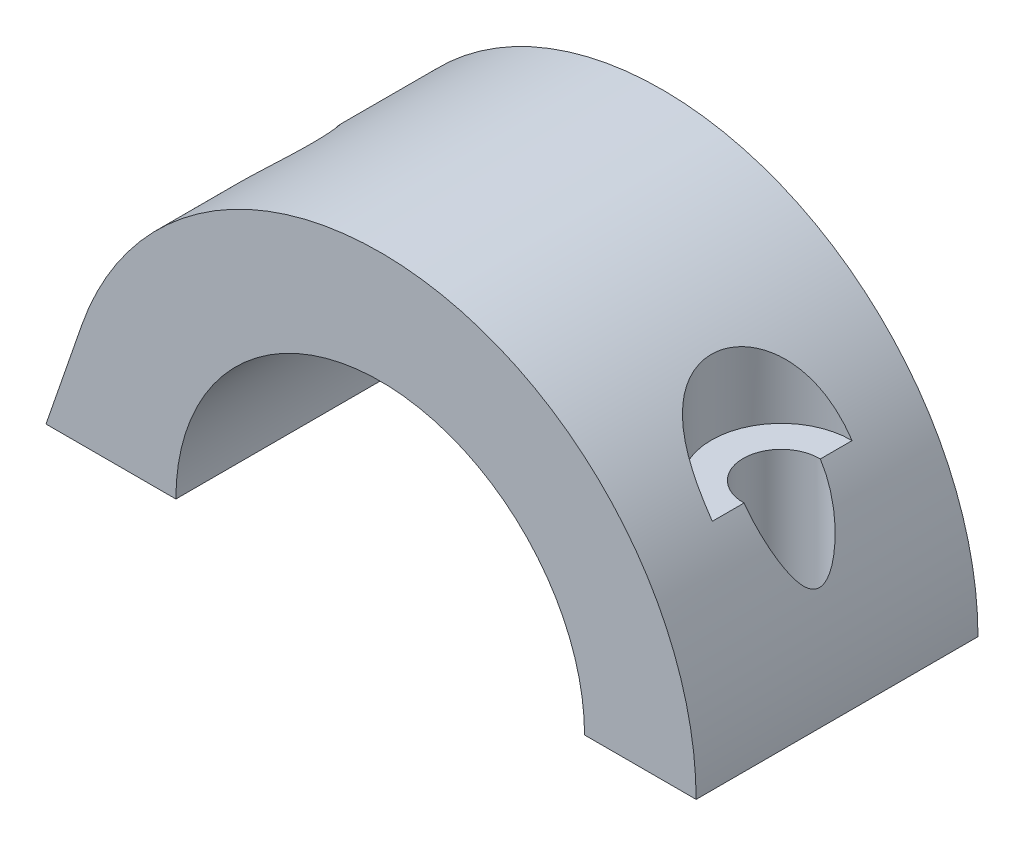
ISO-10303-21;
HEADER;
FILE_DESCRIPTION(('STEP AP214'),'2;1');
FILE_NAME('part.step','',(''),(''),'','','');
FILE_SCHEMA(('AUTOMOTIVE_DESIGN { 1 0 10303 214 1 1 1 1 }'));
ENDSEC;
DATA;
#1=APPLICATION_CONTEXT('core data for automotive mechanical design processes');
#2=APPLICATION_PROTOCOL_DEFINITION('international standard','automotive_design',2000,#1);
#3=PRODUCT_CONTEXT('',#1,'mechanical');
#4=PRODUCT('Part','Part','',(#3));
#5=PRODUCT_RELATED_PRODUCT_CATEGORY('part','',(#4));
#6=PRODUCT_DEFINITION_FORMATION('','',#4);
#7=PRODUCT_DEFINITION_CONTEXT('part definition',#1,'design');
#8=PRODUCT_DEFINITION('design','',#6,#7);
#9=PRODUCT_DEFINITION_SHAPE('','',#8);
#10=(LENGTH_UNIT() NAMED_UNIT(*) SI_UNIT(.MILLI.,.METRE.));
#11=(NAMED_UNIT(*) PLANE_ANGLE_UNIT() SI_UNIT($,.RADIAN.));
#12=(NAMED_UNIT(*) SI_UNIT($,.STERADIAN.) SOLID_ANGLE_UNIT());
#13=UNCERTAINTY_MEASURE_WITH_UNIT(LENGTH_MEASURE(1.E-05),#10,'distance_accuracy_value','');
#14=(GEOMETRIC_REPRESENTATION_CONTEXT(3) GLOBAL_UNCERTAINTY_ASSIGNED_CONTEXT((#13)) GLOBAL_UNIT_ASSIGNED_CONTEXT((#10,
#11,#12)) REPRESENTATION_CONTEXT('',''));
#15=CARTESIAN_POINT('',(0.,0.,0.));
#16=DIRECTION('',(0.,0.,1.));
#17=DIRECTION('',(1.,0.,0.));
#18=AXIS2_PLACEMENT_3D('',#15,#16,#17);
#19=CARTESIAN_POINT('',(0.,0.,11.09));
#20=DIRECTION('',(0.,0.,-1.));
#21=DIRECTION('',(-1.,0.,0.));
#22=AXIS2_PLACEMENT_3D('',#19,#20,#21);
#23=CYLINDRICAL_SURFACE('',#22,12.43);
#24=DIRECTION('',(0.,0.,-1.));
#25=VECTOR('',#24,1.);
#26=CARTESIAN_POINT('',(10.2715578175854,7.,11.09));
#27=LINE('',#26,#25);
#28=CARTESIAN_POINT('',(10.2715578175854,7.,8.29475699398572));
#29=VERTEX_POINT('',#28);
#30=CARTESIAN_POINT('',(10.2715578175854,7.,7.04455444248396));
#31=VERTEX_POINT('',#30);
#32=EDGE_CURVE('E75',#29,#31,#27,.T.);
#33=ORIENTED_EDGE('',*,*,#32,.F.);
#34=CARTESIAN_POINT('',(10.2715578175854,7.,8.29475699398572));
#35=CARTESIAN_POINT('',(10.1775743528023,7.13796097149501,8.29596635901824));
#36=CARTESIAN_POINT('',(10.0806647733626,7.27413950385768,8.29246732032034));
#37=CARTESIAN_POINT('',(9.88143176219571,7.5425504361619,8.27403109068999));
#38=CARTESIAN_POINT('',(9.77908706791482,7.674763600745,8.25904534059461));
#39=CARTESIAN_POINT('',(9.56875440357493,7.93550983106315,8.21526166376967));
#40=CARTESIAN_POINT('',(9.46070697301482,8.06396408100375,8.18627080788423));
#41=CARTESIAN_POINT('',(9.24214240736493,8.31355176391438,8.112105016515));
#42=CARTESIAN_POINT('',(9.13163050609764,8.43469900065435,8.06696178995224));
#43=CARTESIAN_POINT('',(8.90248492159863,8.67642027864925,7.95421876278325));
#44=CARTESIAN_POINT('',(8.78382699503538,8.7963539793624,7.88526215604817));
#45=CARTESIAN_POINT('',(8.5509597080208,9.02287078043261,7.72363577255358));
#46=CARTESIAN_POINT('',(8.43673163596638,9.12951554111868,7.63108208879948));
#47=CARTESIAN_POINT('',(8.23470266467567,9.31183343570367,7.43653311036682));
#48=CARTESIAN_POINT('',(8.14552007951442,9.38975099451332,7.33809363161442));
#49=CARTESIAN_POINT('',(7.97859132902156,9.53199922416819,7.1228487105849));
#50=CARTESIAN_POINT('',(7.90085204360757,9.59632173146949,7.00603230636266));
#51=CARTESIAN_POINT('',(7.79638657853738,9.68108010804122,6.818141544617));
#52=CARTESIAN_POINT('',(7.76346844111074,9.70747049770775,6.75307867186874));
#53=CARTESIAN_POINT('',(7.70242742570889,9.75597382864995,6.61923196333829));
#54=CARTESIAN_POINT('',(7.67430203867741,9.77808900886395,6.55045009948663));
#55=CARTESIAN_POINT('',(7.6234147460337,9.81781518485233,6.40970667034809));
#56=CARTESIAN_POINT('',(7.60065028834737,9.83542832416881,6.33774663748509));
#57=CARTESIAN_POINT('',(7.56094730217063,9.86598173978964,6.19130299871263));
#58=CARTESIAN_POINT('',(7.54400776829297,9.87892282251455,6.11681983073903));
#59=CARTESIAN_POINT('',(7.50644227470543,9.90753101585373,5.91202703709468));
#60=CARTESIAN_POINT('',(7.49183576527122,9.91853501841631,5.7798676318976));
#61=CARTESIAN_POINT('',(7.48196345584333,9.925984045734,5.51452655154878));
#62=CARTESIAN_POINT('',(7.4866886489032,9.92243585058667,5.38134538131685));
#63=CARTESIAN_POINT('',(7.51414814479702,9.90165302973389,5.12699316643034));
#64=CARTESIAN_POINT('',(7.53566507085221,9.88534338803625,5.00561206509047));
#65=CARTESIAN_POINT('',(7.59396135844462,9.84062944404057,4.76893739410604));
#66=CARTESIAN_POINT('',(7.63074014091614,9.81222560061994,4.65364359368405));
#67=CARTESIAN_POINT('',(7.71877198767471,9.7431337317858,4.42871722956267));
#68=CARTESIAN_POINT('',(7.77039713084521,9.70212777858714,4.31932932750632));
#69=CARTESIAN_POINT('',(7.88502292588359,9.60920109463564,4.11175736331971));
#70=CARTESIAN_POINT('',(7.94802818204487,9.5572759446703,4.01357786234651));
#71=CARTESIAN_POINT('',(8.08997270692946,9.43751847343814,3.81950039283026));
#72=CARTESIAN_POINT('',(8.16990064365103,9.36856830126274,3.72502220087933));
#73=CARTESIAN_POINT('',(8.33670907336169,9.22044554245154,3.5516410098516));
#74=CARTESIAN_POINT('',(8.42358998005341,9.14127234737234,3.47273893852577));
#75=CARTESIAN_POINT('',(8.58059709421522,8.99372174239174,3.34656602738719));
#76=CARTESIAN_POINT('',(8.64993374561702,8.92710153399751,3.29620364482466));
#77=CARTESIAN_POINT('',(8.78979999915871,8.78942428062605,3.20386319400854));
#78=CARTESIAN_POINT('',(8.86033013009868,8.71836522927841,3.16188895374464));
#79=CARTESIAN_POINT('',(9.07291046050292,8.49874073109993,3.04739241405974));
#80=CARTESIAN_POINT('',(9.21537731312661,8.34426096398068,2.9867357103872));
#81=CARTESIAN_POINT('',(9.43679154240441,8.09118595196006,2.9119904362259));
#82=CARTESIAN_POINT('',(9.51732274907083,7.99632100390374,2.88904024069819));
#83=CARTESIAN_POINT('',(9.67629528119657,7.8031924971021,2.85111405471563));
#84=CARTESIAN_POINT('',(9.75473561611577,7.70492737647739,2.83614178214999));
#85=CARTESIAN_POINT('',(9.90797287121626,7.50682785632691,2.81342798205444));
#86=CARTESIAN_POINT('',(9.9828033554425,7.40702909905654,2.80559726961814));
#87=CARTESIAN_POINT('',(10.1294709872541,7.20515830323086,2.79604847419687));
#88=CARTESIAN_POINT('',(10.2013118583966,7.10308935124771,2.79432254793103));
#89=CARTESIAN_POINT('',(10.2715578175854,7.,2.79524300601428));
#90=B_SPLINE_CURVE_WITH_KNOTS('',3,(#34,#35,#36,#37,#38,#39,#40,#41,#42,#43,#44,#45,#46,#47,#48,
#49,#50,#51,#52,#53,#54,#55,#56,#57,#58,#59,#60,#61,#62,#63,#64,#65,#66,#67,#68,#69,#70,#71,#72,
#73,#74,#75,#76,#77,#78,#79,#80,#81,#82,#83,#84,#85,#86,#87,#88,#89),.UNSPECIFIED.,.F.,.F.,(4,2,
2,2,2,2,2,2,2,2,2,2,2,2,2,2,2,2,2,2,2,2,2,2,2,2,2,4),(0.,0.500917454493598,1.003964256788,
1.51414748353912,2.02333460931288,2.56835587102882,3.11074580428216,3.57094779692195,
4.03142535101869,4.26376339855895,4.49597943845786,4.72808470726739,4.96014989435971,
5.35808892765878,5.75584257597763,6.12716961638009,6.49848256917162,6.88006182361467,
7.26179580889491,7.68521318300876,8.10865576926938,8.43385305472835,8.75919840912167,
9.41254918330484,9.79192155799501,10.1714705743514,10.5462120979543,10.920471987526),.UNSPECIFIED.);
#91=CARTESIAN_POINT('',(10.2715578175854,7.,2.79524300601428));
#92=VERTEX_POINT('',#91);
#93=EDGE_CURVE('E60',#29,#92,#90,.T.);
#94=ORIENTED_EDGE('',*,*,#93,.T.);
#95=CARTESIAN_POINT('',(10.2715578175854,7.,4.04544555751604));
#96=VERTEX_POINT('',#95);
#97=EDGE_CURVE('E138',#96,#92,#27,.T.);
#98=ORIENTED_EDGE('',*,*,#97,.F.);
#99=CARTESIAN_POINT('',(11.735,4.09813067141594,5.545));
#100=CARTESIAN_POINT('',(11.734998201274,4.09813626053815,5.57751495527273));
#101=CARTESIAN_POINT('',(11.7339280176693,4.10120417459427,5.61005343260603));
#102=CARTESIAN_POINT('',(11.7297920342744,4.11301771860877,5.6739575953403));
#103=CARTESIAN_POINT('',(11.7267222097173,4.12177479931369,5.70532078024865));
#104=CARTESIAN_POINT('',(11.7178411400628,4.14696499837935,5.77461120409417));
#105=CARTESIAN_POINT('',(11.7115039695034,4.16485814549675,5.81192818159886));
#106=CARTESIAN_POINT('',(11.6968460766948,4.2058495996388,5.88313300196056));
#107=CARTESIAN_POINT('',(11.6885204104951,4.22896087241186,5.91701199302612));
#108=CARTESIAN_POINT('',(11.6627523874635,4.29970410786186,6.00911009138384));
#109=CARTESIAN_POINT('',(11.6435694818032,4.35150027914869,6.06358470417758));
#110=CARTESIAN_POINT('',(11.6020699572367,4.46098219857436,6.1647586640645));
#111=CARTESIAN_POINT('',(11.5797438822152,4.51868556986004,6.21143358353822));
#112=CARTESIAN_POINT('',(11.5286781128142,4.64758679376911,6.3064322822024));
#113=CARTESIAN_POINT('',(11.4994948822293,4.7194030853849,6.35366904339458));
#114=CARTESIAN_POINT('',(11.4383992002789,4.8656172651737,6.44205625042915));
#115=CARTESIAN_POINT('',(11.4064836033112,4.94001806857768,6.48319952840527));
#116=CARTESIAN_POINT('',(11.3401295703003,5.09049483767551,6.56052318963946));
#117=CARTESIAN_POINT('',(11.3056854858686,5.16657427090231,6.59669190872918));
#118=CARTESIAN_POINT('',(11.2344785350862,5.3196360033735,6.66457982270113));
#119=CARTESIAN_POINT('',(11.1977150575907,5.39661853619218,6.69629783769401));
#120=CARTESIAN_POINT('',(11.0968312613977,5.60229226874741,6.77531083086894));
#121=CARTESIAN_POINT('',(11.0307359540995,5.73142126468089,6.8189879699385));
#122=CARTESIAN_POINT('',(10.8925910524162,5.98981301367073,6.89548161425763));
#123=CARTESIAN_POINT('',(10.8205371764464,6.11907579583243,6.92829022358208));
#124=CARTESIAN_POINT('',(10.6709058278837,6.37642250340568,6.98246397029529));
#125=CARTESIAN_POINT('',(10.5933413718855,6.50450844949929,7.00385512131246));
#126=CARTESIAN_POINT('',(10.432967048877,6.75874734297934,7.03411383260275));
#127=CARTESIAN_POINT('',(10.3501617202361,6.884901848439,7.04299207757499));
#128=CARTESIAN_POINT('',(10.169437051934,7.14955583888074,7.04661645646634));
#129=CARTESIAN_POINT('',(10.0709076939268,7.28767861080873,7.03950181348377));
#130=CARTESIAN_POINT('',(9.86966527347856,7.55796553406584,7.00341319214272));
#131=CARTESIAN_POINT('',(9.76695770753578,7.69013706075935,6.97446710637854));
#132=CARTESIAN_POINT('',(9.58741319003649,7.91209579239219,6.90052959396313));
#133=CARTESIAN_POINT('',(9.51074345817492,8.00401532553259,6.8616105817075));
#134=CARTESIAN_POINT('',(9.35951700963344,8.18032495213465,6.76626913904293));
#135=CARTESIAN_POINT('',(9.2849570642258,8.26472702864459,6.70987523113521));
#136=CARTESIAN_POINT('',(9.16359775551111,8.3987480154149,6.59701949959309));
#137=CARTESIAN_POINT('',(9.1151889878102,8.4511978611851,6.54567020731706));
#138=CARTESIAN_POINT('',(9.02356882778923,8.54895110812049,6.4325326211845));
#139=CARTESIAN_POINT('',(8.98035025133086,8.59426441523172,6.37075904820715));
#140=CARTESIAN_POINT('',(8.90960732235442,8.66751806521574,6.25012885978215));
#141=CARTESIAN_POINT('',(8.88067008758393,8.69712169767712,6.19311997675601));
#142=CARTESIAN_POINT('',(8.82950395664532,8.74906227822664,6.07304357567219));
#143=CARTESIAN_POINT('',(8.80727200040013,8.77140254145093,6.00997883869179));
#144=CARTESIAN_POINT('',(8.77097669192519,8.80769792239595,5.87862905152207));
#145=CARTESIAN_POINT('',(8.75697720909308,8.82158750582508,5.81030771738582));
#146=CARTESIAN_POINT('',(8.73866988704645,8.83972424253523,5.67113170303384));
#147=CARTESIAN_POINT('',(8.73435507695777,8.84397833131293,5.60027888228537));
#148=CARTESIAN_POINT('',(8.73571209586111,8.84263682269342,5.46779933233416));
#149=CARTESIAN_POINT('',(8.74018672497712,8.83822203216408,5.406142187504));
#150=CARTESIAN_POINT('',(8.75647250869395,8.82208701615342,5.28480306994476));
#151=CARTESIAN_POINT('',(8.76828321913303,8.81036723295145,5.22512097786686));
#152=CARTESIAN_POINT('',(8.79835175148018,8.78033871968954,5.10958332729706));
#153=CARTESIAN_POINT('',(8.81657039632381,8.76207001591138,5.05370692549464));
#154=CARTESIAN_POINT('',(8.85842119905158,8.71975689393834,4.94637196579531));
#155=CARTESIAN_POINT('',(8.88205564339352,8.69571003609676,4.89491528648017));
#156=CARTESIAN_POINT('',(8.94459705444434,8.63144452843406,4.77618983924408));
#157=CARTESIAN_POINT('',(8.98573165084154,8.58869121440812,4.71146166571192));
#158=CARTESIAN_POINT('',(9.07391636724061,8.49547436556447,4.59242427733491));
#159=CARTESIAN_POINT('',(9.12097878401415,8.44499475494607,4.5381373312284));
#160=CARTESIAN_POINT('',(9.23899196463987,8.31602951225907,4.41911628926505));
#161=CARTESIAN_POINT('',(9.31175655988209,8.23461020492472,4.3593836610214));
#162=CARTESIAN_POINT('',(9.46006008432302,8.06380996674828,4.25752649905553));
#163=CARTESIAN_POINT('',(9.53560310771654,7.97441698536703,4.21542918361999));
#164=CARTESIAN_POINT('',(9.66915784119895,7.81157375030617,4.15435969666794));
#165=CARTESIAN_POINT('',(9.72716729877287,7.73924135662559,4.1322876245478));
#166=CARTESIAN_POINT('',(9.84248327518014,7.59204614350651,4.09600468357856));
#167=CARTESIAN_POINT('',(9.89978940682039,7.51718200858792,4.08179797025));
#168=CARTESIAN_POINT('',(10.0132525402738,7.36537020808085,4.06035574052764));
#169=CARTESIAN_POINT('',(10.0694066711844,7.28841823944853,4.05313595748605));
#170=CARTESIAN_POINT('',(10.1800853978122,7.13301272118419,4.04497897585848));
#171=CARTESIAN_POINT('',(10.2346094922717,7.05455872158022,4.04404369045102));
#172=CARTESIAN_POINT('',(10.3685904402913,6.85694811564139,4.04879390507863));
#173=CARTESIAN_POINT('',(10.4468694290406,6.73707057409173,4.05802699248198));
#174=CARTESIAN_POINT('',(10.5986683413674,6.49565174543085,4.08769783710957));
#175=CARTESIAN_POINT('',(10.6721851686465,6.37410943689708,4.1081428039978));
#176=CARTESIAN_POINT('',(10.8139920386018,6.13044129817094,4.15920172595626));
#177=CARTESIAN_POINT('',(10.8822914720962,6.00831695782045,4.1897968544988));
#178=CARTESIAN_POINT('',(11.0135771692497,5.76413123551069,4.26071482206067));
#179=CARTESIAN_POINT('',(11.0765668044453,5.6420698632638,4.3010314245269));
#180=CARTESIAN_POINT('',(11.1819485653011,5.42948120373475,4.38032281339848));
#181=CARTESIAN_POINT('',(11.2255441126538,5.33872383863274,4.41709759439226));
#182=CARTESIAN_POINT('',(11.3095870482772,5.15829781179222,4.49684328076879));
#183=CARTESIAN_POINT('',(11.3500309942694,5.06863042831221,4.5398208188784));
#184=CARTESIAN_POINT('',(11.4102712035696,4.93087294390652,4.61233315989347));
#185=CARTESIAN_POINT('',(11.4312667530425,4.88198755223987,4.63937168610255));
#186=CARTESIAN_POINT('',(11.4721051736854,4.78523306123977,4.69600554312969));
#187=CARTESIAN_POINT('',(11.4919483524677,4.73736369287538,4.7256001863257));
#188=CARTESIAN_POINT('',(11.5303116876576,4.64320892645081,4.78770431544566));
#189=CARTESIAN_POINT('',(11.5488354412373,4.59691941618841,4.82020528493659));
#190=CARTESIAN_POINT('',(11.5844092595325,4.50651892484936,4.88880678659831));
#191=CARTESIAN_POINT('',(11.601460742188,4.46240586559568,4.92490378160552));
#192=CARTESIAN_POINT('',(11.6301630448869,4.38696452124714,4.99312346687822));
#193=CARTESIAN_POINT('',(11.6421727408715,4.35497116237661,5.02435108300577));
#194=CARTESIAN_POINT('',(11.6648232853528,4.29393259733358,5.09022410467296));
#195=CARTESIAN_POINT('',(11.6754610024687,4.26489416620676,5.12487702066858));
#196=CARTESIAN_POINT('',(11.6950085475927,4.21099830066627,5.19878298726414));
#197=CARTESIAN_POINT('',(11.7038861856381,4.18621969609454,5.23810380141397));
#198=CARTESIAN_POINT('',(11.7187817718371,4.14434004922351,5.32109274651943));
#199=CARTESIAN_POINT('',(11.7248174756778,4.12719137516206,5.36473176654426));
#200=CARTESIAN_POINT('',(11.7308961577069,4.10986751386261,5.43192573603056));
#201=CARTESIAN_POINT('',(11.7324248494538,4.10549837558269,5.45428187461005));
#202=CARTESIAN_POINT('',(11.7344774218155,4.09962793610153,5.49942147679471));
#203=CARTESIAN_POINT('',(11.7350012610208,4.09812675308745,5.52220495797142));
#204=CARTESIAN_POINT('',(11.735,4.09813067141594,5.545));
#205=B_SPLINE_CURVE_WITH_KNOTS('',3,(#99,#100,#101,#102,#103,#104,#105,#106,#107,#108,#109,#110,
#111,#112,#113,#114,#115,#116,#117,#118,#119,#120,#121,#122,#123,#124,#125,#126,#127,#128,#129,
#130,#131,#132,#133,#134,#135,#136,#137,#138,#139,#140,#141,#142,#143,#144,#145,#146,#147,#148,
#149,#150,#151,#152,#153,#154,#155,#156,#157,#158,#159,#160,#161,#162,#163,#164,#165,#166,#167,
#168,#169,#170,#171,#172,#173,#174,#175,#176,#177,#178,#179,#180,#181,#182,#183,#184,#185,#186,
#187,#188,#189,#190,#191,#192,#193,#194,#195,#196,#197,#198,#199,#200,#201,#202,#203,#204),
.UNSPECIFIED.,.T.,.F.,(4,2,2,2,2,2,2,2,2,2,2,2,2,2,2,2,2,2,2,2,2,2,2,2,2,2,2,2,2,2,2,2,2,2,2,2,
2,2,2,2,2,2,2,2,2,2,2,2,2,2,2,2,4),(0.,0.097438205586332,0.195073137947423,0.31995081258248,
0.445142260377977,0.676580652769423,0.908730820546712,1.1806459373848,1.45287841449077,
1.72573870978338,1.99867120470185,2.45258998863625,2.90683782246037,3.36004622800157,
3.81286740652096,4.32105820629218,4.82860082177101,5.20509999959952,5.58098786436175,
5.84392431795604,6.10649252057591,6.31702935569158,6.52746996255952,6.73952238168393,
6.95142211981968,7.13644657068903,7.32145982037697,7.50536104719903,7.68934005748138,
7.95128809220794,8.21378875299091,8.58513206815183,8.95704642048347,9.24260263403231,
9.52830957243613,9.81465838641951,10.101094369119,10.5308762111757,10.9609347438822,
11.3902000222262,11.8191906460968,12.1405769539439,12.4623095081761,12.6412913643648,
12.8202252216466,12.9986509310858,13.1769028365112,13.3156070020375,13.4546223428751,
13.595983739313,13.7364498258196,13.8047573614681,13.8730677119791),.UNSPECIFIED.);
#206=EDGE_CURVE('E145',#96,#31,#205,.T.);
#207=ORIENTED_EDGE('',*,*,#206,.T.);
#208=EDGE_LOOP('',(#33,#94,#98,#207));
#209=FACE_BOUND('',#208,.T.);
#210=DIRECTION('',(0.,0.,-1.));
#211=VECTOR('',#210,1.);
#212=CARTESIAN_POINT('',(-10.2715578175854,7.,11.09));
#213=LINE('',#212,#211);
#214=CARTESIAN_POINT('',(-10.2715578175854,7.,3.21908712064356));
#215=VERTEX_POINT('',#214);
#216=CARTESIAN_POINT('',(-10.2715578175854,6.99999999999999,4.48528666469));
#217=VERTEX_POINT('',#216);
#218=EDGE_CURVE('E67',#215,#217,#213,.F.);
#219=ORIENTED_EDGE('',*,*,#218,.F.);
#220=CARTESIAN_POINT('',(-10.2715578175854,7.,3.21908712064356));
#221=CARTESIAN_POINT('',(-10.1845647069069,7.1277015701837,3.2294275267687));
#222=CARTESIAN_POINT('',(-10.0952387104176,7.25360932121075,3.24419244468716));
#223=CARTESIAN_POINT('',(-9.91247076796022,7.5014291508661,3.28438411397836));
#224=CARTESIAN_POINT('',(-9.81901348281058,7.62332278218105,3.30985422277703));
#225=CARTESIAN_POINT('',(-9.6279319544296,7.86331398660677,3.37365632525875));
#226=CARTESIAN_POINT('',(-9.53026770457423,7.98133458491788,3.4121632900939));
#227=CARTESIAN_POINT('',(-9.33381051891724,8.21021113870319,3.503853571795));
#228=CARTESIAN_POINT('',(-9.2350200326001,8.32108006728908,3.55700933582035));
#229=CARTESIAN_POINT('',(-9.02930815524277,8.54409373625616,3.6856782693056));
#230=CARTESIAN_POINT('',(-8.92247727753747,8.65541290418432,3.76280139647575));
#231=CARTESIAN_POINT('',(-8.71463941613853,8.86462463847258,3.93874400106506));
#232=CARTESIAN_POINT('',(-8.61360698259969,8.96257897580319,4.03745776226832));
#233=CARTESIAN_POINT('',(-8.43681936052498,9.12893637523138,4.24116097898404));
#234=CARTESIAN_POINT('',(-8.35954460943746,9.19956811063577,4.34299665433243));
#235=CARTESIAN_POINT('',(-8.21692652765179,9.32717484955611,4.56278368740228));
#236=CARTESIAN_POINT('',(-8.15159004221467,9.3841420237915,4.68074422359326));
#237=CARTESIAN_POINT('',(-8.06569538733362,9.45784898408638,4.86836661902813));
#238=CARTESIAN_POINT('',(-8.03899401134183,9.48053239307028,4.93298840483692));
#239=CARTESIAN_POINT('',(-7.99025626564822,9.52164473384705,5.06525916464857));
#240=CARTESIAN_POINT('',(-7.96821751261074,9.54007583967568,5.1329065705555));
#241=CARTESIAN_POINT('',(-7.9292663812657,9.57247516326244,5.2706732783175));
#242=CARTESIAN_POINT('',(-7.91235172034196,9.58644536835698,5.340791463935));
#243=CARTESIAN_POINT('',(-7.88399897501561,9.60977573668888,5.4828502427834));
#244=CARTESIAN_POINT('',(-7.87256003830957,9.61913661737996,5.55479055056205));
#245=CARTESIAN_POINT('',(-7.84919083771896,9.63823236757694,5.75272806170068));
#246=CARTESIAN_POINT('',(-7.84296948528662,9.64327498540035,5.87993847471503));
#247=CARTESIAN_POINT('',(-7.84820353922418,9.63901453434698,6.13364795797492));
#248=CARTESIAN_POINT('',(-7.85965236311388,9.62971680752497,6.26014727550081));
#249=CARTESIAN_POINT('',(-7.8983608679984,9.59798776047531,6.50215281379663));
#250=CARTESIAN_POINT('',(-7.9247728910018,9.57625999629777,6.61788930364363));
#251=CARTESIAN_POINT('',(-7.99117720708207,9.52091603903582,6.84236632738492));
#252=CARTESIAN_POINT('',(-8.03117028637646,9.48729915767683,6.95110645582102));
#253=CARTESIAN_POINT('',(-8.1248968332488,9.40717362979956,7.16464454153122));
#254=CARTESIAN_POINT('',(-8.17921934475418,9.36010247325945,7.26897047974529));
#255=CARTESIAN_POINT('',(-8.29768881562245,9.25524327935071,7.4659484498429));
#256=CARTESIAN_POINT('',(-8.36184050391459,9.19745008064795,7.55859482323686));
#257=CARTESIAN_POINT('',(-8.52488689306953,9.04698439579873,7.76687495757143));
#258=CARTESIAN_POINT('',(-8.62727444480597,8.94970398574961,7.87645527397342));
#259=CARTESIAN_POINT('',(-8.83945017892205,8.74021209866024,8.07165796822134));
#260=CARTESIAN_POINT('',(-8.94925300693307,8.62797062028255,8.15723110516533));
#261=CARTESIAN_POINT('',(-9.13823804408075,8.42677907649013,8.28435403099079));
#262=CARTESIAN_POINT('',(-9.21689438225988,8.34073008404647,8.33144306839787));
#263=CARTESIAN_POINT('',(-9.37405080269161,8.16370438416263,8.41571218714731));
#264=CARTESIAN_POINT('',(-9.45255078785532,8.0727252488851,8.45288733207032));
#265=CARTESIAN_POINT('',(-9.60841323636431,7.88657456359496,8.51832611479736));
#266=CARTESIAN_POINT('',(-9.68577458231431,7.79139921965176,8.54658149150491));
#267=CARTESIAN_POINT('',(-9.83853762498287,7.5975849194763,8.59512473630234));
#268=CARTESIAN_POINT('',(-9.91393999883972,7.49894718853428,8.61541539263638));
#269=CARTESIAN_POINT('',(-10.036557867158,7.33341926273729,8.64315991626623));
#270=CARTESIAN_POINT('',(-10.0844830158083,7.26737748233713,8.65262537894047));
#271=CARTESIAN_POINT('',(-10.1789955561545,7.13439449926643,8.66877279043601));
#272=CARTESIAN_POINT('',(-10.2255873989259,7.06745775439976,8.67546534650817));
#273=CARTESIAN_POINT('',(-10.2715578175854,7.,8.68091287935644));
#274=B_SPLINE_CURVE_WITH_KNOTS('',3,(#220,#221,#222,#223,#224,#225,#226,#227,#228,#229,#230,
#231,#232,#233,#234,#235,#236,#237,#238,#239,#240,#241,#242,#243,#244,#245,#246,#247,#248,#249,
#250,#251,#252,#253,#254,#255,#256,#257,#258,#259,#260,#261,#262,#263,#264,#265,#266,#267,#268,
#269,#270,#271,#272,#273),.UNSPECIFIED.,.F.,.F.,(4,2,2,2,2,2,2,2,2,2,2,2,2,2,2,2,2,2,2,2,2,2,2,
2,2,2,4),(0.,0.464687508469005,0.931275479350151,1.40439172239349,1.87662408699508,
2.39241409036499,2.90573297274567,3.34217758790739,3.77887167529912,3.99911786210418,
4.21925119490553,4.4392863207845,4.6592871867708,5.03950507870543,5.41958136635245,
5.78001586787636,6.14047123878147,6.51902371529217,6.89775889294973,7.43109007717529,
7.96550730499737,8.34221886848167,8.71911765900396,9.09636449939007,9.47347915730849,
9.71985904948362,9.96528755903464),.UNSPECIFIED.);
#275=CARTESIAN_POINT('',(-10.2715578175854,7.,8.68091287935644));
#276=VERTEX_POINT('',#275);
#277=EDGE_CURVE('E11',#215,#276,#274,.T.);
#278=ORIENTED_EDGE('',*,*,#277,.T.);
#279=CARTESIAN_POINT('',(-10.2715578175854,7.,7.41471333530998));
#280=VERTEX_POINT('',#279);
#281=EDGE_CURVE('E147',#280,#276,#213,.F.);
#282=ORIENTED_EDGE('',*,*,#281,.F.);
#283=CARTESIAN_POINT('',(-11.7494220532319,4.05659727049987,4.99223712589611));
#284=CARTESIAN_POINT('',(-11.7199518952009,4.14196430729866,4.95676032831749));
#285=CARTESIAN_POINT('',(-11.6893140002292,4.22767730400995,4.92311933501807));
#286=CARTESIAN_POINT('',(-11.6257244562087,4.39952280829262,4.85928496328337));
#287=CARTESIAN_POINT('',(-11.5927729507282,4.48565528952524,4.82909137122848));
#288=CARTESIAN_POINT('',(-11.5244975982004,4.65827179039993,4.7718592145927));
#289=CARTESIAN_POINT('',(-11.4891685851195,4.74475616503703,4.74482789440208));
#290=CARTESIAN_POINT('',(-11.4162145355241,4.91769818662144,4.69398118352517));
#291=CARTESIAN_POINT('',(-11.3785894428697,5.00415583286324,4.67016587151695));
#292=CARTESIAN_POINT('',(-11.2615611434975,5.26484875629196,4.60321122212794));
#293=CARTESIAN_POINT('',(-11.178625388749,5.43882886768441,4.56508525096972));
#294=CARTESIAN_POINT('',(-11.0036378002441,5.78466434623678,4.50376413834014));
#295=CARTESIAN_POINT('',(-10.9115963736429,5.95652189221838,4.48055217357795));
#296=CARTESIAN_POINT('',(-10.7681456774087,6.20975705648793,4.45926968338096));
#297=CARTESIAN_POINT('',(-10.7200290169301,6.29245972869039,4.45441244214557));
#298=CARTESIAN_POINT('',(-10.6218289229398,6.45684220023715,4.44943349534115));
#299=CARTESIAN_POINT('',(-10.5717455925312,6.53852205290773,4.44931154185431));
#300=CARTESIAN_POINT('',(-10.4698346203804,6.70049234324491,4.45436211206289));
#301=CARTESIAN_POINT('',(-10.4180093563559,6.78078446508552,4.45952768123044));
#302=CARTESIAN_POINT('',(-10.3128297459362,6.93970787693727,4.47581866774952));
#303=CARTESIAN_POINT('',(-10.2594756402718,7.01833942507135,4.48694315164126));
#304=CARTESIAN_POINT('',(-10.1171550302005,7.22300995171116,4.52520087073145));
#305=CARTESIAN_POINT('',(-10.0271205381833,7.34739394893401,4.55801586112254));
#306=CARTESIAN_POINT('',(-9.89185046606731,7.52740813754559,4.62407347309266));
#307=CARTESIAN_POINT('',(-9.84675016934593,7.58628711044033,4.64887935025885));
#308=CARTESIAN_POINT('',(-9.75702415007447,7.70134293657405,4.70477265935898));
#309=CARTESIAN_POINT('',(-9.71239815572407,7.75752141050498,4.7358562639728));
#310=CARTESIAN_POINT('',(-9.61553702604546,7.87739830089023,4.8119444610578));
#311=CARTESIAN_POINT('',(-9.56356629858881,7.94035182051837,4.85849008016582));
#312=CARTESIAN_POINT('',(-9.46330375519872,8.05957992927837,4.96283994594745));
#313=CARTESIAN_POINT('',(-9.41500813619529,8.11586145731563,5.02063232766488));
#314=CARTESIAN_POINT('',(-9.33397241256127,8.20882881534775,5.13532788019509));
#315=CARTESIAN_POINT('',(-9.30006250262774,8.24717506812359,5.19004259445889));
#316=CARTESIAN_POINT('',(-9.23817676585495,8.31643821019393,5.3070443414623));
#317=CARTESIAN_POINT('',(-9.21019323935323,8.34736474634625,5.36932138141548));
#318=CARTESIAN_POINT('',(-9.166447396026,8.3953565012687,5.48896850110017));
#319=CARTESIAN_POINT('',(-9.14940050769678,8.41390390426422,5.54526982787768));
#320=CARTESIAN_POINT('',(-9.12183960875682,8.44377638142817,5.66130335482495));
#321=CARTESIAN_POINT('',(-9.11132198142064,8.45510545410703,5.72103363554));
#322=CARTESIAN_POINT('',(-9.09760030322922,8.46986867497506,5.84255040720546));
#323=CARTESIAN_POINT('',(-9.09442533991458,8.47327142387213,5.90434409569988));
#324=CARTESIAN_POINT('',(-9.09574635756089,8.4718533504208,6.02775193946057));
#325=CARTESIAN_POINT('',(-9.10024188629948,8.46703301287356,6.08936610509628));
#326=CARTESIAN_POINT('',(-9.11599986701991,8.45006301168247,6.20658368894462));
#327=CARTESIAN_POINT('',(-9.12681424810304,8.43839846131617,6.26232028546056));
#328=CARTESIAN_POINT('',(-9.1540986655222,8.40879189923595,6.37062741180614));
#329=CARTESIAN_POINT('',(-9.17057044398766,8.39084795382351,6.42319696051233));
#330=CARTESIAN_POINT('',(-9.21426250811258,8.3428782119229,6.54044382360019));
#331=CARTESIAN_POINT('',(-9.24323533218365,8.31082443186852,6.60363845857935));
#332=CARTESIAN_POINT('',(-9.30722777851806,8.23909757453595,6.72214030515337));
#333=CARTESIAN_POINT('',(-9.34225815105279,8.19941093700486,6.7774331693814));
#334=CARTESIAN_POINT('',(-9.43095754163572,8.0974119706121,6.90014056836798));
#335=CARTESIAN_POINT('',(-9.48655647027146,8.03232255941952,6.96383320198842));
#336=CARTESIAN_POINT('',(-9.60189165947304,7.89409411662005,7.07707310373216));
#337=CARTESIAN_POINT('',(-9.66163489256718,7.82094139097297,7.1265957776705));
#338=CARTESIAN_POINT('',(-9.76921022571064,7.68590598895391,7.20355914240246));
#339=CARTESIAN_POINT('',(-9.81673147422091,7.62514219616667,7.23346140021374));
#340=CARTESIAN_POINT('',(-9.91198857610278,7.50090174113182,7.28658839068177));
#341=CARTESIAN_POINT('',(-9.95972453310798,7.43742360557678,7.30980944264259));
#342=CARTESIAN_POINT('',(-10.1024861493705,7.24364065804719,7.37062297549195));
#343=CARTESIAN_POINT('',(-10.1969716071067,7.11010456204499,7.39930333360892));
#344=CARTESIAN_POINT('',(-10.3658624108061,6.86094378693544,7.43445306020012));
#345=CARTESIAN_POINT('',(-10.4409493891001,6.74613645611549,7.44387083662581));
#346=CARTESIAN_POINT('',(-10.5874787874254,6.51375827946653,7.45177509509743));
#347=CARTESIAN_POINT('',(-10.6589187811274,6.39618566795318,7.45025439284534));
#348=CARTESIAN_POINT('',(-10.7978194312209,6.15881275990106,7.43786387124471));
#349=CARTESIAN_POINT('',(-10.8652687034271,6.03900726233734,7.42696856545408));
#350=CARTESIAN_POINT('',(-10.9957582239186,5.79801523838707,7.39702234846285));
#351=CARTESIAN_POINT('',(-11.0587976752199,5.67682846694267,7.37796996744712));
#352=CARTESIAN_POINT('',(-11.181984962009,5.43025041874564,7.33198714923731));
#353=CARTESIAN_POINT('',(-11.2420078190322,5.30483432041053,7.30485686318316));
#354=CARTESIAN_POINT('',(-11.3572069751411,5.05350003831175,7.24356033657154));
#355=CARTESIAN_POINT('',(-11.4123830100764,4.92758182757359,7.20939371287483));
#356=CARTESIAN_POINT('',(-11.5173086674249,4.67704423570713,7.1346752787146));
#357=CARTESIAN_POINT('',(-11.5671093396366,4.55242514860422,7.09419453875413));
#358=CARTESIAN_POINT('',(-11.6381965780738,4.36597143821218,7.02832407717035));
#359=CARTESIAN_POINT('',(-11.6612885971477,4.30390351473581,7.0055107394218));
#360=CARTESIAN_POINT('',(-11.7062641610117,4.18002706592009,6.95804541237439));
#361=CARTESIAN_POINT('',(-11.7281475980964,4.11821856415174,6.93339325966422));
#362=CARTESIAN_POINT('',(-11.7494220532319,4.05659727049985,6.90776287410398));
#363=B_SPLINE_CURVE_WITH_KNOTS('',3,(#283,#284,#285,#286,#287,#288,#289,#290,#291,#292,#293,
#294,#295,#296,#297,#298,#299,#300,#301,#302,#303,#304,#305,#306,#307,#308,#309,#310,#311,#312,
#313,#314,#315,#316,#317,#318,#319,#320,#321,#322,#323,#324,#325,#326,#327,#328,#329,#330,#331,
#332,#333,#334,#335,#336,#337,#338,#339,#340,#341,#342,#343,#344,#345,#346,#347,#348,#349,#350,
#351,#352,#353,#354,#355,#356,#357,#358,#359,#360,#361,#362),.UNSPECIFIED.,.F.,.F.,(4,2,2,2,2,2,
2,2,2,2,2,2,2,2,2,2,2,2,2,2,2,2,2,2,2,2,2,2,2,2,2,2,2,2,2,2,2,2,2,4),(0.,0.291043601285666,
0.582069158139222,0.873748878986936,1.16543573434411,1.75410825625273,2.34211557280555,
2.62941261127228,2.91669460817256,3.20359923615858,3.49045893387563,3.95976118290966,
4.19414167086664,4.42837969392222,4.70949266929196,4.99031067207041,5.21427958271868,
5.43795569923886,5.62222167294441,5.80638548570354,5.99127761227989,6.17615883871275,
6.34929395522085,6.52248243453729,6.75088187242759,6.97969088836945,7.29802483424783,
7.61690799269838,7.86476550517814,8.1127593027843,8.60922951142105,9.02124390330128,
9.43352892736197,9.8469383722319,10.2604223403035,10.6851326140224,11.1098660199769,
11.5301242296822,11.7402250653627,11.9503445945222),.UNSPECIFIED.);
#364=CARTESIAN_POINT('',(-11.7494220532319,4.05659727049987,6.90776287410389));
#365=VERTEX_POINT('',#364);
#366=EDGE_CURVE('E166',#280,#365,#363,.T.);
#367=ORIENTED_EDGE('',*,*,#366,.T.);
#368=DIRECTION('',(0.,0.,-1.));
#369=VECTOR('',#368,1.);
#370=CARTESIAN_POINT('',(-11.7494220532319,4.05659727049987,11.09));
#371=LINE('',#370,#369);
#372=CARTESIAN_POINT('',(-11.7494220532319,4.05659727049987,11.09));
#373=VERTEX_POINT('',#372);
#374=EDGE_CURVE('E362',#373,#365,#371,.T.);
#375=ORIENTED_EDGE('',*,*,#374,.F.);
#376=CARTESIAN_POINT('',(0.,0.,11.09));
#377=DIRECTION('',(0.,0.,1.));
#378=DIRECTION('',(1.,0.,0.));
#379=AXIS2_PLACEMENT_3D('',#376,#377,#378);
#380=CIRCLE('',#379,12.43);
#381=CARTESIAN_POINT('',(12.43,0.,11.09));
#382=VERTEX_POINT('',#381);
#383=EDGE_CURVE('E369',#382,#373,#380,.T.);
#384=ORIENTED_EDGE('',*,*,#383,.F.);
#385=DIRECTION('',(0.,0.,-1.));
#386=VECTOR('',#385,1.);
#387=CARTESIAN_POINT('',(12.43,0.,11.09));
#388=LINE('',#387,#386);
#389=CARTESIAN_POINT('',(12.43,0.,0.));
#390=VERTEX_POINT('',#389);
#391=EDGE_CURVE('E337',#382,#390,#388,.T.);
#392=ORIENTED_EDGE('',*,*,#391,.T.);
#393=CARTESIAN_POINT('',(0.,0.,0.));
#394=DIRECTION('',(0.,0.,1.));
#395=DIRECTION('',(1.,0.,0.));
#396=AXIS2_PLACEMENT_3D('',#393,#394,#395);
#397=CIRCLE('',#396,12.43);
#398=CARTESIAN_POINT('',(-11.7494220532319,4.05659727049987,0.));
#399=VERTEX_POINT('',#398);
#400=EDGE_CURVE('E341',#390,#399,#397,.T.);
#401=ORIENTED_EDGE('',*,*,#400,.T.);
#402=CARTESIAN_POINT('',(-11.7494220532319,4.05659727049987,4.99223712589611));
#403=VERTEX_POINT('',#402);
#404=EDGE_CURVE('E361',#403,#399,#371,.T.);
#405=ORIENTED_EDGE('',*,*,#404,.F.);
#406=EDGE_CURVE('E167',#403,#217,#363,.T.);
#407=ORIENTED_EDGE('',*,*,#406,.T.);
#408=EDGE_LOOP('',(#219,#278,#282,#367,#375,#384,#392,#401,#405,#407));
#409=FACE_BOUND('',#408,.T.);
#410=ADVANCED_FACE('F45',(#209,#409),#23,.T.);
#411=CARTESIAN_POINT('',(-10.595,10.,5.95));
#412=DIRECTION('',(0.,-1.,0.));
#413=DIRECTION('',(1.,0.,0.));
#414=AXIS2_PLACEMENT_3D('',#411,#412,#413);
#415=CYLINDRICAL_SURFACE('',#414,1.5);
#416=CARTESIAN_POINT('',(-10.595,0.,5.95));
#417=DIRECTION('',(0.,-1.,0.));
#418=DIRECTION('',(1.,0.,0.));
#419=AXIS2_PLACEMENT_3D('',#416,#417,#418);
#420=CIRCLE('',#419,1.5);
#421=CARTESIAN_POINT('',(-9.095,0.,5.95));
#422=VERTEX_POINT('',#421);
#423=EDGE_CURVE('E154',#422,#422,#420,.T.);
#424=ORIENTED_EDGE('',*,*,#423,.T.);
#425=EDGE_LOOP('',(#424));
#426=FACE_BOUND('',#425,.T.);
#427=CARTESIAN_POINT('',(-10.595,7.,5.95));
#428=DIRECTION('',(0.,1.,0.));
#429=DIRECTION('',(0.,0.,1.));
#430=AXIS2_PLACEMENT_3D('',#427,#428,#429);
#431=CIRCLE('',#430,1.5);
#432=EDGE_CURVE('E136',#217,#280,#431,.F.);
#433=ORIENTED_EDGE('',*,*,#432,.F.);
#434=ORIENTED_EDGE('',*,*,#406,.F.);
#435=CARTESIAN_POINT('',(-10.595,7.40023506013664,5.95));
#436=DIRECTION('',(0.945247148288974,-0.32635537172163,0.));
#437=DIRECTION('',(-0.32635537172163,-0.945247148288974,0.));
#438=AXIS2_PLACEMENT_3D('',#435,#436,#437);
#439=ELLIPSE('',#438,4.59621667045655,1.5);
#440=EDGE_CURVE('E158',#365,#403,#439,.T.);
#441=ORIENTED_EDGE('',*,*,#440,.F.);
#442=ORIENTED_EDGE('',*,*,#366,.F.);
#443=EDGE_LOOP('',(#433,#434,#441,#442));
#444=FACE_BOUND('',#443,.T.);
#445=ADVANCED_FACE('F180',(#426,#444),#415,.F.);
#446=CARTESIAN_POINT('',(10.235,10.,5.545));
#447=DIRECTION('',(0.,-1.,0.));
#448=DIRECTION('',(1.,0.,0.));
#449=AXIS2_PLACEMENT_3D('',#446,#447,#448);
#450=CYLINDRICAL_SURFACE('',#449,1.5);
#451=CARTESIAN_POINT('',(10.235,0.,5.545));
#452=DIRECTION('',(0.,-1.,0.));
#453=DIRECTION('',(1.,0.,0.));
#454=AXIS2_PLACEMENT_3D('',#451,#452,#453);
#455=CIRCLE('',#454,1.5);
#456=CARTESIAN_POINT('',(11.735,0.,5.545));
#457=VERTEX_POINT('',#456);
#458=EDGE_CURVE('E159',#457,#457,#455,.T.);
#459=ORIENTED_EDGE('',*,*,#458,.T.);
#460=EDGE_LOOP('',(#459));
#461=FACE_BOUND('',#460,.T.);
#462=CARTESIAN_POINT('',(10.235,7.,5.545));
#463=DIRECTION('',(0.,1.,0.));
#464=DIRECTION('',(0.,0.,1.));
#465=AXIS2_PLACEMENT_3D('',#462,#463,#464);
#466=CIRCLE('',#465,1.5);
#467=EDGE_CURVE('E204',#31,#96,#466,.F.);
#468=ORIENTED_EDGE('',*,*,#467,.F.);
#469=ORIENTED_EDGE('',*,*,#206,.F.);
#470=EDGE_LOOP('',(#468,#469));
#471=FACE_BOUND('',#470,.T.);
#472=ADVANCED_FACE('F185',(#461,#471),#450,.F.);
#473=CARTESIAN_POINT('',(0.,0.,11.09));
#474=DIRECTION('',(0.,0.,-1.));
#475=DIRECTION('',(-1.,0.,0.));
#476=AXIS2_PLACEMENT_3D('',#473,#474,#475);
#477=CYLINDRICAL_SURFACE('',#476,8.04);
#478=CARTESIAN_POINT('',(0.,0.,0.));
#479=DIRECTION('',(0.,0.,-1.));
#480=DIRECTION('',(-1.,0.,0.));
#481=AXIS2_PLACEMENT_3D('',#478,#479,#480);
#482=CIRCLE('',#481,8.04);
#483=CARTESIAN_POINT('',(-8.04,0.,0.));
#484=VERTEX_POINT('',#483);
#485=CARTESIAN_POINT('',(8.04,0.,0.));
#486=VERTEX_POINT('',#485);
#487=EDGE_CURVE('E201',#484,#486,#482,.T.);
#488=ORIENTED_EDGE('',*,*,#487,.T.);
#489=DIRECTION('',(0.,0.,-1.));
#490=VECTOR('',#489,1.);
#491=CARTESIAN_POINT('',(8.04,0.,11.09));
#492=LINE('',#491,#490);
#493=CARTESIAN_POINT('',(8.04,0.,11.09));
#494=VERTEX_POINT('',#493);
#495=EDGE_CURVE('E202',#494,#486,#492,.T.);
#496=ORIENTED_EDGE('',*,*,#495,.F.);
#497=CARTESIAN_POINT('',(0.,0.,11.09));
#498=DIRECTION('',(0.,0.,-1.));
#499=DIRECTION('',(1.,0.,0.));
#500=AXIS2_PLACEMENT_3D('',#497,#498,#499);
#501=CIRCLE('',#500,8.04);
#502=CARTESIAN_POINT('',(-8.04,0.,11.09));
#503=VERTEX_POINT('',#502);
#504=EDGE_CURVE('E176',#503,#494,#501,.T.);
#505=ORIENTED_EDGE('',*,*,#504,.F.);
#506=DIRECTION('',(0.,0.,-1.));
#507=VECTOR('',#506,1.);
#508=CARTESIAN_POINT('',(-8.04,0.,11.09));
#509=LINE('',#508,#507);
#510=EDGE_CURVE('E325',#503,#484,#509,.T.);
#511=ORIENTED_EDGE('',*,*,#510,.T.);
#512=EDGE_LOOP('',(#488,#496,#505,#511));
#513=FACE_BOUND('',#512,.T.);
#514=ADVANCED_FACE('F47',(#513),#477,.F.);
#515=CARTESIAN_POINT('',(8.04,0.,11.09));
#516=DIRECTION('',(0.,1.,0.));
#517=DIRECTION('',(0.,0.,1.));
#518=AXIS2_PLACEMENT_3D('',#515,#516,#517);
#519=PLANE('',#518);
#520=ORIENTED_EDGE('',*,*,#458,.F.);
#521=EDGE_LOOP('',(#520));
#522=FACE_BOUND('',#521,.T.);
#523=DIRECTION('',(1.,0.,0.));
#524=VECTOR('',#523,1.);
#525=CARTESIAN_POINT('',(8.04,0.,0.));
#526=LINE('',#525,#524);
#527=EDGE_CURVE('E330',#486,#390,#526,.T.);
#528=ORIENTED_EDGE('',*,*,#527,.T.);
#529=ORIENTED_EDGE('',*,*,#391,.F.);
#530=DIRECTION('',(1.,0.,0.));
#531=VECTOR('',#530,1.);
#532=CARTESIAN_POINT('',(8.04,0.,11.09));
#533=LINE('',#532,#531);
#534=EDGE_CURVE('E335',#494,#382,#533,.T.);
#535=ORIENTED_EDGE('',*,*,#534,.F.);
#536=ORIENTED_EDGE('',*,*,#495,.T.);
#537=EDGE_LOOP('',(#528,#529,#535,#536));
#538=FACE_BOUND('',#537,.T.);
#539=ADVANCED_FACE('F294',(#522,#538),#519,.F.);
#540=CARTESIAN_POINT('',(-13.15,0.,11.09));
#541=DIRECTION('',(0.945247148288974,-0.32635537172163,0.));
#542=DIRECTION('',(0.32635537172163,0.945247148288974,0.));
#543=AXIS2_PLACEMENT_3D('',#540,#541,#542);
#544=PLANE('',#543);
#545=ORIENTED_EDGE('',*,*,#374,.T.);
#546=ORIENTED_EDGE('',*,*,#440,.T.);
#547=ORIENTED_EDGE('',*,*,#404,.T.);
#548=DIRECTION('',(-0.32635537172163,-0.945247148288974,0.));
#549=VECTOR('',#548,1.);
#550=CARTESIAN_POINT('',(-13.15,0.,0.));
#551=LINE('',#550,#549);
#552=CARTESIAN_POINT('',(-13.15,0.,0.));
#553=VERTEX_POINT('',#552);
#554=EDGE_CURVE('E345',#399,#553,#551,.T.);
#555=ORIENTED_EDGE('',*,*,#554,.T.);
#556=DIRECTION('',(0.,0.,-1.));
#557=VECTOR('',#556,1.);
#558=CARTESIAN_POINT('',(-13.15,0.,11.09));
#559=LINE('',#558,#557);
#560=CARTESIAN_POINT('',(-13.15,0.,11.09));
#561=VERTEX_POINT('',#560);
#562=EDGE_CURVE('E356',#561,#553,#559,.T.);
#563=ORIENTED_EDGE('',*,*,#562,.F.);
#564=DIRECTION('',(-0.32635537172163,-0.945247148288974,0.));
#565=VECTOR('',#564,1.);
#566=CARTESIAN_POINT('',(-13.15,0.,11.09));
#567=LINE('',#566,#565);
#568=EDGE_CURVE('E372',#373,#561,#567,.T.);
#569=ORIENTED_EDGE('',*,*,#568,.F.);
#570=EDGE_LOOP('',(#545,#546,#547,#555,#563,#569));
#571=FACE_BOUND('',#570,.T.);
#572=ADVANCED_FACE('F286',(#571),#544,.F.);
#573=CARTESIAN_POINT('',(-8.04,0.,11.09));
#574=DIRECTION('',(0.,1.,0.));
#575=DIRECTION('',(-1.,0.,0.));
#576=AXIS2_PLACEMENT_3D('',#573,#574,#575);
#577=PLANE('',#576);
#578=ORIENTED_EDGE('',*,*,#423,.F.);
#579=EDGE_LOOP('',(#578));
#580=FACE_BOUND('',#579,.T.);
#581=DIRECTION('',(1.,0.,0.));
#582=VECTOR('',#581,1.);
#583=CARTESIAN_POINT('',(-8.04,0.,0.));
#584=LINE('',#583,#582);
#585=EDGE_CURVE('E351',#553,#484,#584,.T.);
#586=ORIENTED_EDGE('',*,*,#585,.T.);
#587=ORIENTED_EDGE('',*,*,#510,.F.);
#588=DIRECTION('',(1.,0.,0.));
#589=VECTOR('',#588,1.);
#590=CARTESIAN_POINT('',(-8.04,0.,11.09));
#591=LINE('',#590,#589);
#592=EDGE_CURVE('E357',#561,#503,#591,.T.);
#593=ORIENTED_EDGE('',*,*,#592,.F.);
#594=ORIENTED_EDGE('',*,*,#562,.T.);
#595=EDGE_LOOP('',(#586,#587,#593,#594));
#596=FACE_BOUND('',#595,.T.);
#597=ADVANCED_FACE('F233',(#580,#596),#577,.F.);
#598=CARTESIAN_POINT('',(0.,0.,11.09));
#599=DIRECTION('',(0.,0.,1.));
#600=DIRECTION('',(1.,0.,0.));
#601=AXIS2_PLACEMENT_3D('',#598,#599,#600);
#602=PLANE('',#601);
#603=ORIENTED_EDGE('',*,*,#504,.T.);
#604=ORIENTED_EDGE('',*,*,#534,.T.);
#605=ORIENTED_EDGE('',*,*,#383,.T.);
#606=ORIENTED_EDGE('',*,*,#568,.T.);
#607=ORIENTED_EDGE('',*,*,#592,.T.);
#608=EDGE_LOOP('',(#603,#604,#605,#606,#607));
#609=FACE_BOUND('',#608,.T.);
#610=ADVANCED_FACE('F192',(#609),#602,.T.);
#611=CARTESIAN_POINT('',(0.,0.,0.));
#612=DIRECTION('',(0.,0.,1.));
#613=DIRECTION('',(1.,0.,0.));
#614=AXIS2_PLACEMENT_3D('',#611,#612,#613);
#615=PLANE('',#614);
#616=ORIENTED_EDGE('',*,*,#487,.F.);
#617=ORIENTED_EDGE('',*,*,#585,.F.);
#618=ORIENTED_EDGE('',*,*,#554,.F.);
#619=ORIENTED_EDGE('',*,*,#400,.F.);
#620=ORIENTED_EDGE('',*,*,#527,.F.);
#621=EDGE_LOOP('',(#616,#617,#618,#619,#620));
#622=FACE_BOUND('',#621,.T.);
#623=ADVANCED_FACE('F214',(#622),#615,.F.);
#624=CARTESIAN_POINT('',(10.235,7.,5.545));
#625=DIRECTION('',(0.,1.,0.));
#626=DIRECTION('',(0.,0.,1.));
#627=AXIS2_PLACEMENT_3D('',#624,#625,#626);
#628=CYLINDRICAL_SURFACE('',#627,2.75);
#629=CARTESIAN_POINT('',(10.235,7.,5.545));
#630=DIRECTION('',(0.,1.,0.));
#631=DIRECTION('',(0.,0.,1.));
#632=AXIS2_PLACEMENT_3D('',#629,#630,#631);
#633=CIRCLE('',#632,2.75);
#634=EDGE_CURVE('E132',#92,#29,#633,.T.);
#635=ORIENTED_EDGE('',*,*,#634,.F.);
#636=ORIENTED_EDGE('',*,*,#93,.F.);
#637=EDGE_LOOP('',(#635,#636));
#638=FACE_BOUND('',#637,.T.);
#639=ADVANCED_FACE('F131',(#638),#628,.F.);
#640=CARTESIAN_POINT('',(10.235,7.,5.545));
#641=DIRECTION('',(0.,1.,0.));
#642=DIRECTION('',(0.,0.,1.));
#643=AXIS2_PLACEMENT_3D('',#640,#641,#642);
#644=PLANE('',#643);
#645=ORIENTED_EDGE('',*,*,#32,.T.);
#646=ORIENTED_EDGE('',*,*,#467,.T.);
#647=ORIENTED_EDGE('',*,*,#97,.T.);
#648=ORIENTED_EDGE('',*,*,#634,.T.);
#649=EDGE_LOOP('',(#645,#646,#647,#648));
#650=FACE_BOUND('',#649,.T.);
#651=ADVANCED_FACE('F137',(#650),#644,.T.);
#652=CARTESIAN_POINT('',(-10.595,7.,5.95));
#653=DIRECTION('',(0.,1.,0.));
#654=DIRECTION('',(0.,0.,1.));
#655=AXIS2_PLACEMENT_3D('',#652,#653,#654);
#656=CYLINDRICAL_SURFACE('',#655,2.75);
#657=CARTESIAN_POINT('',(-10.595,7.,5.95));
#658=DIRECTION('',(0.,1.,0.));
#659=DIRECTION('',(0.,0.,1.));
#660=AXIS2_PLACEMENT_3D('',#657,#658,#659);
#661=CIRCLE('',#660,2.75);
#662=EDGE_CURVE('E140',#276,#215,#661,.T.);
#663=ORIENTED_EDGE('',*,*,#662,.F.);
#664=ORIENTED_EDGE('',*,*,#277,.F.);
#665=EDGE_LOOP('',(#663,#664));
#666=FACE_BOUND('',#665,.T.);
#667=ADVANCED_FACE('F215',(#666),#656,.F.);
#668=CARTESIAN_POINT('',(-10.595,7.,5.95));
#669=DIRECTION('',(0.,1.,0.));
#670=DIRECTION('',(0.,0.,1.));
#671=AXIS2_PLACEMENT_3D('',#668,#669,#670);
#672=PLANE('',#671);
#673=ORIENTED_EDGE('',*,*,#218,.T.);
#674=ORIENTED_EDGE('',*,*,#432,.T.);
#675=ORIENTED_EDGE('',*,*,#281,.T.);
#676=ORIENTED_EDGE('',*,*,#662,.T.);
#677=EDGE_LOOP('',(#673,#674,#675,#676));
#678=FACE_BOUND('',#677,.T.);
#679=ADVANCED_FACE('F219',(#678),#672,.T.);
#680=CLOSED_SHELL('',(#410,#445,#472,#514,#539,#572,#597,#610,#623,#639,#651,#667,#679));
#681=MANIFOLD_SOLID_BREP('B2',#680);
#682=ADVANCED_BREP_SHAPE_REPRESENTATION('',(#18,#681),#14);
#683=SHAPE_DEFINITION_REPRESENTATION(#9,#682);
ENDSEC;
END-ISO-10303-21;
